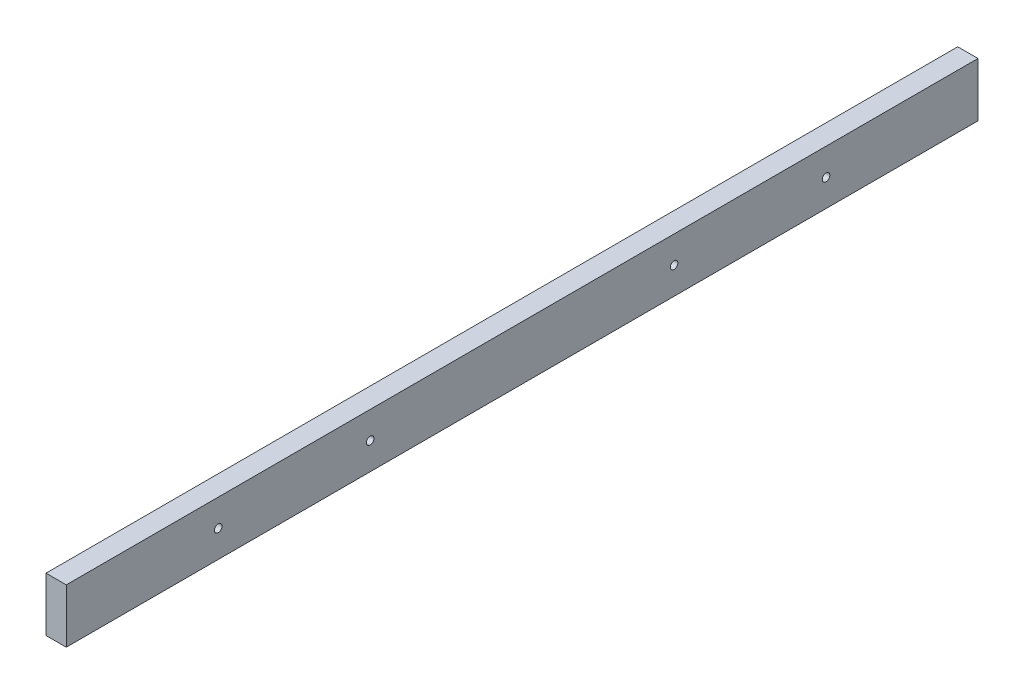
ISO-10303-21;
HEADER;
FILE_DESCRIPTION(('STEP AP214'),'2;1');
FILE_NAME('part.step','',(''),(''),'','','');
FILE_SCHEMA(('AUTOMOTIVE_DESIGN { 1 0 10303 214 1 1 1 1 }'));
ENDSEC;
DATA;
#1=APPLICATION_CONTEXT('core data for automotive mechanical design processes');
#2=APPLICATION_PROTOCOL_DEFINITION('international standard','automotive_design',2000,#1);
#3=PRODUCT_CONTEXT('',#1,'mechanical');
#4=PRODUCT('Part','Part','',(#3));
#5=PRODUCT_RELATED_PRODUCT_CATEGORY('part','',(#4));
#6=PRODUCT_DEFINITION_FORMATION('','',#4);
#7=PRODUCT_DEFINITION_CONTEXT('part definition',#1,'design');
#8=PRODUCT_DEFINITION('design','',#6,#7);
#9=PRODUCT_DEFINITION_SHAPE('','',#8);
#10=(LENGTH_UNIT() NAMED_UNIT(*) SI_UNIT(.MILLI.,.METRE.));
#11=(NAMED_UNIT(*) PLANE_ANGLE_UNIT() SI_UNIT($,.RADIAN.));
#12=(NAMED_UNIT(*) SI_UNIT($,.STERADIAN.) SOLID_ANGLE_UNIT());
#13=UNCERTAINTY_MEASURE_WITH_UNIT(LENGTH_MEASURE(1.E-05),#10,'distance_accuracy_value','');
#14=(GEOMETRIC_REPRESENTATION_CONTEXT(3) GLOBAL_UNCERTAINTY_ASSIGNED_CONTEXT((#13)) GLOBAL_UNIT_ASSIGNED_CONTEXT((#10,
#11,#12)) REPRESENTATION_CONTEXT('',''));
#15=CARTESIAN_POINT('',(0.,0.,0.));
#16=DIRECTION('',(0.,0.,1.));
#17=DIRECTION('',(1.,0.,0.));
#18=AXIS2_PLACEMENT_3D('',#15,#16,#17);
#19=CARTESIAN_POINT('',(-3.,16.,-135.));
#20=DIRECTION('',(1.,0.,0.));
#21=DIRECTION('',(0.,0.,-1.));
#22=AXIS2_PLACEMENT_3D('',#19,#20,#21);
#23=PLANE('',#22);
#24=CARTESIAN_POINT('',(-3.,8.,90.));
#25=DIRECTION('',(1.,0.,0.));
#26=DIRECTION('',(0.,0.,-1.));
#27=AXIS2_PLACEMENT_3D('',#24,#25,#26);
#28=CIRCLE('',#27,1.125);
#29=CARTESIAN_POINT('',(-3.,8.,88.875));
#30=VERTEX_POINT('',#29);
#31=EDGE_CURVE('E98',#30,#30,#28,.T.);
#32=ORIENTED_EDGE('',*,*,#31,.T.);
#33=EDGE_LOOP('',(#32));
#34=FACE_BOUND('',#33,.T.);
#35=CARTESIAN_POINT('',(-3.,8.,-45.));
#36=DIRECTION('',(1.,0.,0.));
#37=DIRECTION('',(0.,0.,-1.));
#38=AXIS2_PLACEMENT_3D('',#35,#36,#37);
#39=CIRCLE('',#38,1.125);
#40=CARTESIAN_POINT('',(-3.,8.,-46.125));
#41=VERTEX_POINT('',#40);
#42=EDGE_CURVE('E111',#41,#41,#39,.T.);
#43=ORIENTED_EDGE('',*,*,#42,.T.);
#44=EDGE_LOOP('',(#43));
#45=FACE_BOUND('',#44,.T.);
#46=CARTESIAN_POINT('',(-3.,8.,-90.));
#47=DIRECTION('',(1.,0.,0.));
#48=DIRECTION('',(0.,0.,-1.));
#49=AXIS2_PLACEMENT_3D('',#46,#47,#48);
#50=CIRCLE('',#49,1.125);
#51=CARTESIAN_POINT('',(-3.,8.,-91.125));
#52=VERTEX_POINT('',#51);
#53=EDGE_CURVE('E114',#52,#52,#50,.T.);
#54=ORIENTED_EDGE('',*,*,#53,.T.);
#55=EDGE_LOOP('',(#54));
#56=FACE_BOUND('',#55,.T.);
#57=CARTESIAN_POINT('',(-3.,8.,45.));
#58=DIRECTION('',(1.,0.,0.));
#59=DIRECTION('',(0.,0.,-1.));
#60=AXIS2_PLACEMENT_3D('',#57,#58,#59);
#61=CIRCLE('',#60,1.125);
#62=CARTESIAN_POINT('',(-3.,8.,43.875));
#63=VERTEX_POINT('',#62);
#64=EDGE_CURVE('E117',#63,#63,#61,.T.);
#65=ORIENTED_EDGE('',*,*,#64,.T.);
#66=EDGE_LOOP('',(#65));
#67=FACE_BOUND('',#66,.T.);
#68=DIRECTION('',(0.,0.,1.));
#69=VECTOR('',#68,1.);
#70=CARTESIAN_POINT('',(-3.,0.,-135.));
#71=LINE('',#70,#69);
#72=CARTESIAN_POINT('',(-3.,0.,-135.));
#73=VERTEX_POINT('',#72);
#74=CARTESIAN_POINT('',(-3.,0.,135.));
#75=VERTEX_POINT('',#74);
#76=EDGE_CURVE('E95',#73,#75,#71,.T.);
#77=ORIENTED_EDGE('',*,*,#76,.T.);
#78=DIRECTION('',(0.,-1.,0.));
#79=VECTOR('',#78,1.);
#80=CARTESIAN_POINT('',(-3.,16.,135.));
#81=LINE('',#80,#79);
#82=CARTESIAN_POINT('',(-3.,16.,135.));
#83=VERTEX_POINT('',#82);
#84=EDGE_CURVE('E11',#83,#75,#81,.T.);
#85=ORIENTED_EDGE('',*,*,#84,.F.);
#86=DIRECTION('',(0.,0.,1.));
#87=VECTOR('',#86,1.);
#88=CARTESIAN_POINT('',(-3.,16.,-135.));
#89=LINE('',#88,#87);
#90=CARTESIAN_POINT('',(-3.,16.,-135.));
#91=VERTEX_POINT('',#90);
#92=EDGE_CURVE('E83',#91,#83,#89,.T.);
#93=ORIENTED_EDGE('',*,*,#92,.F.);
#94=DIRECTION('',(0.,-1.,0.));
#95=VECTOR('',#94,1.);
#96=CARTESIAN_POINT('',(-3.,16.,-135.));
#97=LINE('',#96,#95);
#98=EDGE_CURVE('E91',#91,#73,#97,.T.);
#99=ORIENTED_EDGE('',*,*,#98,.T.);
#100=EDGE_LOOP('',(#77,#85,#93,#99));
#101=FACE_BOUND('',#100,.T.);
#102=ADVANCED_FACE('F32',(#34,#45,#56,#67,#101),#23,.F.);
#103=CARTESIAN_POINT('',(-3.,16.,135.));
#104=DIRECTION('',(0.,0.,-1.));
#105=DIRECTION('',(-1.,0.,0.));
#106=AXIS2_PLACEMENT_3D('',#103,#104,#105);
#107=PLANE('',#106);
#108=DIRECTION('',(1.,0.,0.));
#109=VECTOR('',#108,1.);
#110=CARTESIAN_POINT('',(-3.,0.,135.));
#111=LINE('',#110,#109);
#112=CARTESIAN_POINT('',(3.00000000000003,0.,135.));
#113=VERTEX_POINT('',#112);
#114=EDGE_CURVE('E87',#75,#113,#111,.T.);
#115=ORIENTED_EDGE('',*,*,#114,.T.);
#116=DIRECTION('',(0.,-1.,0.));
#117=VECTOR('',#116,1.);
#118=CARTESIAN_POINT('',(3.00000000000003,16.,135.));
#119=LINE('',#118,#117);
#120=CARTESIAN_POINT('',(3.00000000000003,16.,135.));
#121=VERTEX_POINT('',#120);
#122=EDGE_CURVE('E40',#121,#113,#119,.T.);
#123=ORIENTED_EDGE('',*,*,#122,.F.);
#124=DIRECTION('',(1.,0.,0.));
#125=VECTOR('',#124,1.);
#126=CARTESIAN_POINT('',(-3.,16.,135.));
#127=LINE('',#126,#125);
#128=EDGE_CURVE('E78',#83,#121,#127,.T.);
#129=ORIENTED_EDGE('',*,*,#128,.F.);
#130=ORIENTED_EDGE('',*,*,#84,.T.);
#131=EDGE_LOOP('',(#115,#123,#129,#130));
#132=FACE_BOUND('',#131,.T.);
#133=ADVANCED_FACE('F86',(#132),#107,.F.);
#134=CARTESIAN_POINT('',(3.,16.,-135.));
#135=DIRECTION('',(-1.,0.,0.));
#136=DIRECTION('',(0.,0.,1.));
#137=AXIS2_PLACEMENT_3D('',#134,#135,#136);
#138=PLANE('',#137);
#139=CARTESIAN_POINT('',(3.00000000000003,8.,90.));
#140=DIRECTION('',(1.,0.,0.));
#141=DIRECTION('',(0.,0.,-1.));
#142=AXIS2_PLACEMENT_3D('',#139,#140,#141);
#143=CIRCLE('',#142,1.125);
#144=CARTESIAN_POINT('',(3.00000000000003,8.,88.875));
#145=VERTEX_POINT('',#144);
#146=EDGE_CURVE('E120',#145,#145,#143,.T.);
#147=ORIENTED_EDGE('',*,*,#146,.F.);
#148=EDGE_LOOP('',(#147));
#149=FACE_BOUND('',#148,.T.);
#150=CARTESIAN_POINT('',(3.00000000000001,8.,-45.));
#151=DIRECTION('',(1.,0.,0.));
#152=DIRECTION('',(0.,0.,-1.));
#153=AXIS2_PLACEMENT_3D('',#150,#151,#152);
#154=CIRCLE('',#153,1.125);
#155=CARTESIAN_POINT('',(3.00000000000001,8.,-46.125));
#156=VERTEX_POINT('',#155);
#157=EDGE_CURVE('E125',#156,#156,#154,.T.);
#158=ORIENTED_EDGE('',*,*,#157,.F.);
#159=EDGE_LOOP('',(#158));
#160=FACE_BOUND('',#159,.T.);
#161=CARTESIAN_POINT('',(3.00000000000001,8.,-90.));
#162=DIRECTION('',(1.,0.,0.));
#163=DIRECTION('',(0.,0.,-1.));
#164=AXIS2_PLACEMENT_3D('',#161,#162,#163);
#165=CIRCLE('',#164,1.125);
#166=CARTESIAN_POINT('',(3.00000000000001,8.,-91.125));
#167=VERTEX_POINT('',#166);
#168=EDGE_CURVE('E121',#167,#167,#165,.T.);
#169=ORIENTED_EDGE('',*,*,#168,.F.);
#170=EDGE_LOOP('',(#169));
#171=FACE_BOUND('',#170,.T.);
#172=CARTESIAN_POINT('',(3.00000000000002,8.,45.));
#173=DIRECTION('',(1.,0.,0.));
#174=DIRECTION('',(0.,0.,-1.));
#175=AXIS2_PLACEMENT_3D('',#172,#173,#174);
#176=CIRCLE('',#175,1.125);
#177=CARTESIAN_POINT('',(3.00000000000002,8.,43.875));
#178=VERTEX_POINT('',#177);
#179=EDGE_CURVE('E124',#178,#178,#176,.T.);
#180=ORIENTED_EDGE('',*,*,#179,.F.);
#181=EDGE_LOOP('',(#180));
#182=FACE_BOUND('',#181,.T.);
#183=DIRECTION('',(0.,0.,-1.));
#184=VECTOR('',#183,1.);
#185=CARTESIAN_POINT('',(3.,0.,-135.));
#186=LINE('',#185,#184);
#187=CARTESIAN_POINT('',(3.,0.,-135.));
#188=VERTEX_POINT('',#187);
#189=EDGE_CURVE('E65',#113,#188,#186,.T.);
#190=ORIENTED_EDGE('',*,*,#189,.T.);
#191=DIRECTION('',(0.,-1.,0.));
#192=VECTOR('',#191,1.);
#193=CARTESIAN_POINT('',(3.,16.,-135.));
#194=LINE('',#193,#192);
#195=CARTESIAN_POINT('',(3.,16.,-135.));
#196=VERTEX_POINT('',#195);
#197=EDGE_CURVE('E88',#196,#188,#194,.T.);
#198=ORIENTED_EDGE('',*,*,#197,.F.);
#199=DIRECTION('',(0.,0.,-1.));
#200=VECTOR('',#199,1.);
#201=CARTESIAN_POINT('',(3.,16.,-135.));
#202=LINE('',#201,#200);
#203=EDGE_CURVE('E81',#121,#196,#202,.T.);
#204=ORIENTED_EDGE('',*,*,#203,.F.);
#205=ORIENTED_EDGE('',*,*,#122,.T.);
#206=EDGE_LOOP('',(#190,#198,#204,#205));
#207=FACE_BOUND('',#206,.T.);
#208=ADVANCED_FACE('F89',(#149,#160,#171,#182,#207),#138,.F.);
#209=CARTESIAN_POINT('',(-3.,16.,-135.));
#210=DIRECTION('',(0.,0.,1.));
#211=DIRECTION('',(1.,0.,0.));
#212=AXIS2_PLACEMENT_3D('',#209,#210,#211);
#213=PLANE('',#212);
#214=DIRECTION('',(-1.,0.,0.));
#215=VECTOR('',#214,1.);
#216=CARTESIAN_POINT('',(-3.,0.,-135.));
#217=LINE('',#216,#215);
#218=EDGE_CURVE('E71',#188,#73,#217,.T.);
#219=ORIENTED_EDGE('',*,*,#218,.T.);
#220=ORIENTED_EDGE('',*,*,#98,.F.);
#221=DIRECTION('',(-1.,0.,0.));
#222=VECTOR('',#221,1.);
#223=CARTESIAN_POINT('',(-3.,16.,-135.));
#224=LINE('',#223,#222);
#225=EDGE_CURVE('E48',#196,#91,#224,.T.);
#226=ORIENTED_EDGE('',*,*,#225,.F.);
#227=ORIENTED_EDGE('',*,*,#197,.T.);
#228=EDGE_LOOP('',(#219,#220,#226,#227));
#229=FACE_BOUND('',#228,.T.);
#230=ADVANCED_FACE('F103',(#229),#213,.F.);
#231=CARTESIAN_POINT('',(0.,16.,0.));
#232=DIRECTION('',(0.,1.,0.));
#233=DIRECTION('',(0.,0.,1.));
#234=AXIS2_PLACEMENT_3D('',#231,#232,#233);
#235=PLANE('',#234);
#236=ORIENTED_EDGE('',*,*,#92,.T.);
#237=ORIENTED_EDGE('',*,*,#128,.T.);
#238=ORIENTED_EDGE('',*,*,#203,.T.);
#239=ORIENTED_EDGE('',*,*,#225,.T.);
#240=EDGE_LOOP('',(#236,#237,#238,#239));
#241=FACE_BOUND('',#240,.T.);
#242=ADVANCED_FACE('F79',(#241),#235,.T.);
#243=CARTESIAN_POINT('',(0.,0.,0.));
#244=DIRECTION('',(0.,1.,0.));
#245=DIRECTION('',(0.,0.,1.));
#246=AXIS2_PLACEMENT_3D('',#243,#244,#245);
#247=PLANE('',#246);
#248=ORIENTED_EDGE('',*,*,#76,.F.);
#249=ORIENTED_EDGE('',*,*,#218,.F.);
#250=ORIENTED_EDGE('',*,*,#189,.F.);
#251=ORIENTED_EDGE('',*,*,#114,.F.);
#252=EDGE_LOOP('',(#248,#249,#250,#251));
#253=FACE_BOUND('',#252,.T.);
#254=ADVANCED_FACE('F106',(#253),#247,.F.);
#255=CARTESIAN_POINT('',(-6.99999999999998,8.,45.));
#256=DIRECTION('',(1.,0.,0.));
#257=DIRECTION('',(0.,0.,-1.));
#258=AXIS2_PLACEMENT_3D('',#255,#256,#257);
#259=CYLINDRICAL_SURFACE('',#258,1.125);
#260=ORIENTED_EDGE('',*,*,#179,.T.);
#261=EDGE_LOOP('',(#260));
#262=FACE_BOUND('',#261,.T.);
#263=ORIENTED_EDGE('',*,*,#64,.F.);
#264=EDGE_LOOP('',(#263));
#265=FACE_BOUND('',#264,.T.);
#266=ADVANCED_FACE('F145',(#262,#265),#259,.F.);
#267=CARTESIAN_POINT('',(-6.99999999999999,8.,-90.));
#268=DIRECTION('',(1.,0.,0.));
#269=DIRECTION('',(0.,0.,-1.));
#270=AXIS2_PLACEMENT_3D('',#267,#268,#269);
#271=CYLINDRICAL_SURFACE('',#270,1.125);
#272=ORIENTED_EDGE('',*,*,#168,.T.);
#273=EDGE_LOOP('',(#272));
#274=FACE_BOUND('',#273,.T.);
#275=ORIENTED_EDGE('',*,*,#53,.F.);
#276=EDGE_LOOP('',(#275));
#277=FACE_BOUND('',#276,.T.);
#278=ADVANCED_FACE('F148',(#274,#277),#271,.F.);
#279=CARTESIAN_POINT('',(-6.99999999999999,8.,-45.));
#280=DIRECTION('',(1.,0.,0.));
#281=DIRECTION('',(0.,0.,-1.));
#282=AXIS2_PLACEMENT_3D('',#279,#280,#281);
#283=CYLINDRICAL_SURFACE('',#282,1.125);
#284=ORIENTED_EDGE('',*,*,#157,.T.);
#285=EDGE_LOOP('',(#284));
#286=FACE_BOUND('',#285,.T.);
#287=ORIENTED_EDGE('',*,*,#42,.F.);
#288=EDGE_LOOP('',(#287));
#289=FACE_BOUND('',#288,.T.);
#290=ADVANCED_FACE('F164',(#286,#289),#283,.F.);
#291=CARTESIAN_POINT('',(-6.99999999999998,8.,90.));
#292=DIRECTION('',(1.,0.,0.));
#293=DIRECTION('',(0.,0.,-1.));
#294=AXIS2_PLACEMENT_3D('',#291,#292,#293);
#295=CYLINDRICAL_SURFACE('',#294,1.125);
#296=ORIENTED_EDGE('',*,*,#146,.T.);
#297=EDGE_LOOP('',(#296));
#298=FACE_BOUND('',#297,.T.);
#299=ORIENTED_EDGE('',*,*,#31,.F.);
#300=EDGE_LOOP('',(#299));
#301=FACE_BOUND('',#300,.T.);
#302=ADVANCED_FACE('F133',(#298,#301),#295,.F.);
#303=CLOSED_SHELL('',(#102,#133,#208,#230,#242,#254,#266,#278,#290,#302));
#304=MANIFOLD_SOLID_BREP('B2',#303);
#305=ADVANCED_BREP_SHAPE_REPRESENTATION('',(#18,#304),#14);
#306=SHAPE_DEFINITION_REPRESENTATION(#9,#305);
ENDSEC;
END-ISO-10303-21;
